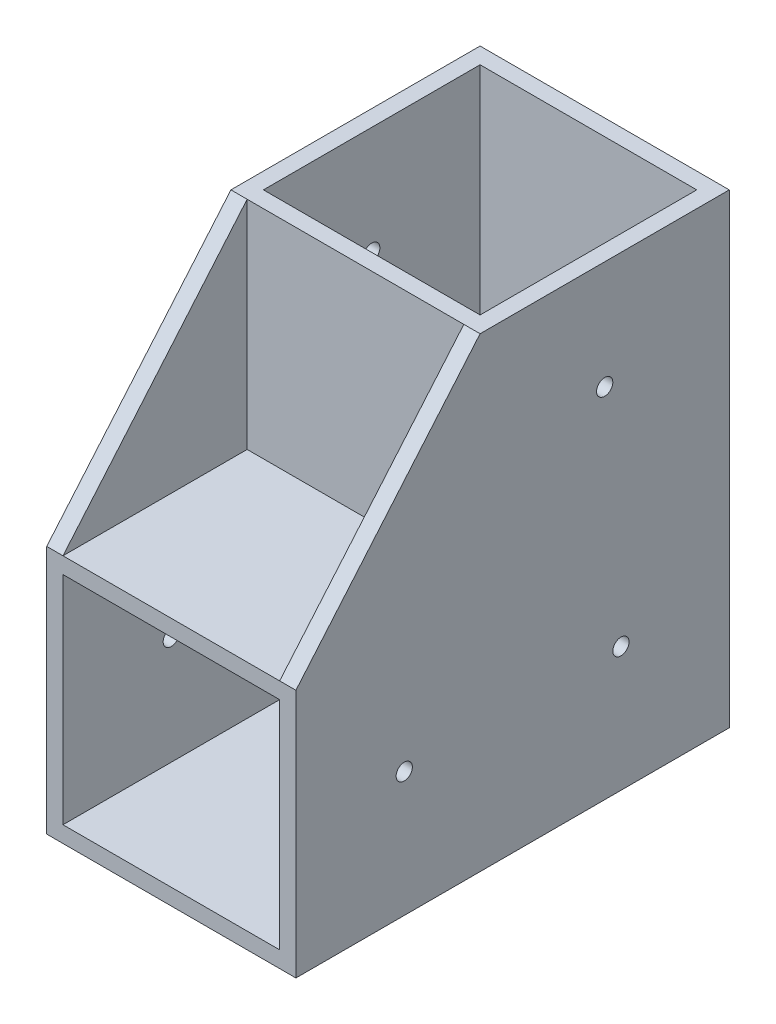
ISO-10303-21;
HEADER;
FILE_DESCRIPTION(('STEP AP214'),'2;1');
FILE_NAME('part.step','',(''),(''),'','','');
FILE_SCHEMA(('AUTOMOTIVE_DESIGN { 1 0 10303 214 1 1 1 1 }'));
ENDSEC;
DATA;
#1=APPLICATION_CONTEXT('core data for automotive mechanical design processes');
#2=APPLICATION_PROTOCOL_DEFINITION('international standard','automotive_design',2000,#1);
#3=PRODUCT_CONTEXT('',#1,'mechanical');
#4=PRODUCT('Part','Part','',(#3));
#5=PRODUCT_RELATED_PRODUCT_CATEGORY('part','',(#4));
#6=PRODUCT_DEFINITION_FORMATION('','',#4);
#7=PRODUCT_DEFINITION_CONTEXT('part definition',#1,'design');
#8=PRODUCT_DEFINITION('design','',#6,#7);
#9=PRODUCT_DEFINITION_SHAPE('','',#8);
#10=(LENGTH_UNIT() NAMED_UNIT(*) SI_UNIT(.MILLI.,.METRE.));
#11=(NAMED_UNIT(*) PLANE_ANGLE_UNIT() SI_UNIT($,.RADIAN.));
#12=(NAMED_UNIT(*) SI_UNIT($,.STERADIAN.) SOLID_ANGLE_UNIT());
#13=UNCERTAINTY_MEASURE_WITH_UNIT(LENGTH_MEASURE(1.E-05),#10,'distance_accuracy_value','');
#14=(GEOMETRIC_REPRESENTATION_CONTEXT(3) GLOBAL_UNCERTAINTY_ASSIGNED_CONTEXT((#13)) GLOBAL_UNIT_ASSIGNED_CONTEXT((#10,
#11,#12)) REPRESENTATION_CONTEXT('',''));
#15=CARTESIAN_POINT('',(0.,0.,0.));
#16=DIRECTION('',(0.,0.,1.));
#17=DIRECTION('',(1.,0.,0.));
#18=AXIS2_PLACEMENT_3D('',#15,#16,#17);
#19=CARTESIAN_POINT('',(0.,0.,80.));
#20=DIRECTION('',(0.,-1.,0.));
#21=DIRECTION('',(0.,0.,-1.));
#22=AXIS2_PLACEMENT_3D('',#19,#20,#21);
#23=PLANE('',#22);
#24=DIRECTION('',(0.,0.,1.));
#25=VECTOR('',#24,1.);
#26=CARTESIAN_POINT('',(3.,0.,80.));
#27=LINE('',#26,#25);
#28=CARTESIAN_POINT('',(3.,0.,46.));
#29=VERTEX_POINT('',#28);
#30=CARTESIAN_POINT('',(3.,0.,80.));
#31=VERTEX_POINT('',#30);
#32=EDGE_CURVE('E158',#29,#31,#27,.T.);
#33=ORIENTED_EDGE('',*,*,#32,.T.);
#34=DIRECTION('',(-1.,0.,0.));
#35=VECTOR('',#34,1.);
#36=CARTESIAN_POINT('',(0.,0.,80.));
#37=LINE('',#36,#35);
#38=CARTESIAN_POINT('',(43.,0.,80.));
#39=VERTEX_POINT('',#38);
#40=EDGE_CURVE('E252',#39,#31,#37,.T.);
#41=ORIENTED_EDGE('',*,*,#40,.F.);
#42=DIRECTION('',(0.,0.,-1.));
#43=VECTOR('',#42,1.);
#44=CARTESIAN_POINT('',(43.,0.,46.));
#45=LINE('',#44,#43);
#46=CARTESIAN_POINT('',(43.,0.,46.));
#47=VERTEX_POINT('',#46);
#48=EDGE_CURVE('E180',#39,#47,#45,.T.);
#49=ORIENTED_EDGE('',*,*,#48,.T.);
#50=DIRECTION('',(1.,0.,0.));
#51=VECTOR('',#50,1.);
#52=CARTESIAN_POINT('',(0.,0.,46.));
#53=LINE('',#52,#51);
#54=EDGE_CURVE('E172',#29,#47,#53,.T.);
#55=ORIENTED_EDGE('',*,*,#54,.F.);
#56=EDGE_LOOP('',(#33,#41,#49,#55));
#57=FACE_BOUND('',#56,.T.);
#58=ADVANCED_FACE('F42',(#57),#23,.F.);
#59=CARTESIAN_POINT('',(0.,40.,46.));
#60=DIRECTION('',(0.,0.,-1.));
#61=DIRECTION('',(-1.,0.,0.));
#62=AXIS2_PLACEMENT_3D('',#59,#60,#61);
#63=PLANE('',#62);
#64=DIRECTION('',(0.,-1.,0.));
#65=VECTOR('',#64,1.);
#66=CARTESIAN_POINT('',(3.,0.,46.));
#67=LINE('',#66,#65);
#68=CARTESIAN_POINT('',(3.,40.,46.));
#69=VERTEX_POINT('',#68);
#70=EDGE_CURVE('E161',#69,#29,#67,.T.);
#71=ORIENTED_EDGE('',*,*,#70,.T.);
#72=ORIENTED_EDGE('',*,*,#54,.T.);
#73=DIRECTION('',(0.,1.,0.));
#74=VECTOR('',#73,1.);
#75=CARTESIAN_POINT('',(43.,40.,46.));
#76=LINE('',#75,#74);
#77=CARTESIAN_POINT('',(43.,40.,46.));
#78=VERTEX_POINT('',#77);
#79=EDGE_CURVE('E307',#47,#78,#76,.T.);
#80=ORIENTED_EDGE('',*,*,#79,.T.);
#81=DIRECTION('',(1.,0.,0.));
#82=VECTOR('',#81,1.);
#83=CARTESIAN_POINT('',(0.,40.,46.));
#84=LINE('',#83,#82);
#85=EDGE_CURVE('E174',#69,#78,#84,.T.);
#86=ORIENTED_EDGE('',*,*,#85,.F.);
#87=EDGE_LOOP('',(#71,#72,#80,#86));
#88=FACE_BOUND('',#87,.T.);
#89=ADVANCED_FACE('F170',(#88),#63,.F.);
#90=CARTESIAN_POINT('',(0.,0.,80.));
#91=DIRECTION('',(0.,0.,1.));
#92=DIRECTION('',(1.,0.,0.));
#93=AXIS2_PLACEMENT_3D('',#90,#91,#92);
#94=PLANE('',#93);
#95=DIRECTION('',(0.,-1.,0.));
#96=VECTOR('',#95,1.);
#97=CARTESIAN_POINT('',(0.,0.,80.));
#98=LINE('',#97,#96);
#99=CARTESIAN_POINT('',(0.,0.,80.));
#100=VERTEX_POINT('',#99);
#101=CARTESIAN_POINT('',(0.,-46.,80.));
#102=VERTEX_POINT('',#101);
#103=EDGE_CURVE('E240',#100,#102,#98,.T.);
#104=ORIENTED_EDGE('',*,*,#103,.T.);
#105=DIRECTION('',(1.,0.,0.));
#106=VECTOR('',#105,1.);
#107=CARTESIAN_POINT('',(0.,-46.,80.));
#108=LINE('',#107,#106);
#109=CARTESIAN_POINT('',(46.,-46.,80.));
#110=VERTEX_POINT('',#109);
#111=EDGE_CURVE('E244',#102,#110,#108,.T.);
#112=ORIENTED_EDGE('',*,*,#111,.T.);
#113=DIRECTION('',(0.,1.,0.));
#114=VECTOR('',#113,1.);
#115=CARTESIAN_POINT('',(46.,0.,80.));
#116=LINE('',#115,#114);
#117=CARTESIAN_POINT('',(46.,0.,80.));
#118=VERTEX_POINT('',#117);
#119=EDGE_CURVE('E248',#110,#118,#116,.T.);
#120=ORIENTED_EDGE('',*,*,#119,.T.);
#121=EDGE_CURVE('E253',#118,#39,#37,.T.);
#122=ORIENTED_EDGE('',*,*,#121,.T.);
#123=ORIENTED_EDGE('',*,*,#40,.T.);
#124=DIRECTION('',(-1.,0.,0.));
#125=VECTOR('',#124,1.);
#126=CARTESIAN_POINT('',(3.,0.,80.));
#127=LINE('',#126,#125);
#128=EDGE_CURVE('E297',#31,#100,#127,.T.);
#129=ORIENTED_EDGE('',*,*,#128,.T.);
#130=EDGE_LOOP('',(#104,#112,#120,#122,#123,#129));
#131=FACE_BOUND('',#130,.T.);
#132=DIRECTION('',(1.,0.,0.));
#133=VECTOR('',#132,1.);
#134=CARTESIAN_POINT('',(3.00000000000001,-43.,80.));
#135=LINE('',#134,#133);
#136=CARTESIAN_POINT('',(3.00000000000001,-43.,80.));
#137=VERTEX_POINT('',#136);
#138=CARTESIAN_POINT('',(43.,-43.,80.));
#139=VERTEX_POINT('',#138);
#140=EDGE_CURVE('E199',#137,#139,#135,.T.);
#141=ORIENTED_EDGE('',*,*,#140,.F.);
#142=DIRECTION('',(0.,-1.,0.));
#143=VECTOR('',#142,1.);
#144=CARTESIAN_POINT('',(3.,-3.,80.));
#145=LINE('',#144,#143);
#146=CARTESIAN_POINT('',(3.,-3.,80.));
#147=VERTEX_POINT('',#146);
#148=EDGE_CURVE('E196',#147,#137,#145,.T.);
#149=ORIENTED_EDGE('',*,*,#148,.F.);
#150=DIRECTION('',(-1.,0.,0.));
#151=VECTOR('',#150,1.);
#152=CARTESIAN_POINT('',(3.,-3.,80.));
#153=LINE('',#152,#151);
#154=CARTESIAN_POINT('',(43.,-3.,80.));
#155=VERTEX_POINT('',#154);
#156=EDGE_CURVE('E207',#155,#147,#153,.T.);
#157=ORIENTED_EDGE('',*,*,#156,.F.);
#158=DIRECTION('',(0.,1.,0.));
#159=VECTOR('',#158,1.);
#160=CARTESIAN_POINT('',(43.,-3.,80.));
#161=LINE('',#160,#159);
#162=EDGE_CURVE('E203',#139,#155,#161,.T.);
#163=ORIENTED_EDGE('',*,*,#162,.F.);
#164=EDGE_LOOP('',(#141,#149,#157,#163));
#165=FACE_BOUND('',#164,.T.);
#166=ADVANCED_FACE('F377',(#131,#165),#94,.T.);
#167=CARTESIAN_POINT('',(0.,0.,0.));
#168=DIRECTION('',(0.,0.,1.));
#169=DIRECTION('',(1.,0.,0.));
#170=AXIS2_PLACEMENT_3D('',#167,#168,#169);
#171=PLANE('',#170);
#172=DIRECTION('',(0.,-1.,0.));
#173=VECTOR('',#172,1.);
#174=CARTESIAN_POINT('',(0.,0.,0.));
#175=LINE('',#174,#173);
#176=CARTESIAN_POINT('',(0.,40.,0.));
#177=VERTEX_POINT('',#176);
#178=CARTESIAN_POINT('',(0.,-46.,0.));
#179=VERTEX_POINT('',#178);
#180=EDGE_CURVE('E239',#177,#179,#175,.T.);
#181=ORIENTED_EDGE('',*,*,#180,.F.);
#182=DIRECTION('',(-1.,0.,0.));
#183=VECTOR('',#182,1.);
#184=CARTESIAN_POINT('',(0.,40.,0.));
#185=LINE('',#184,#183);
#186=CARTESIAN_POINT('',(46.,40.,0.));
#187=VERTEX_POINT('',#186);
#188=EDGE_CURVE('E194',#187,#177,#185,.T.);
#189=ORIENTED_EDGE('',*,*,#188,.F.);
#190=DIRECTION('',(0.,1.,0.));
#191=VECTOR('',#190,1.);
#192=CARTESIAN_POINT('',(46.,0.,0.));
#193=LINE('',#192,#191);
#194=CARTESIAN_POINT('',(46.,-46.,0.));
#195=VERTEX_POINT('',#194);
#196=EDGE_CURVE('E245',#195,#187,#193,.T.);
#197=ORIENTED_EDGE('',*,*,#196,.F.);
#198=DIRECTION('',(1.,0.,0.));
#199=VECTOR('',#198,1.);
#200=CARTESIAN_POINT('',(0.,-46.,0.));
#201=LINE('',#200,#199);
#202=EDGE_CURVE('E260',#179,#195,#201,.T.);
#203=ORIENTED_EDGE('',*,*,#202,.F.);
#204=EDGE_LOOP('',(#181,#189,#197,#203));
#205=FACE_BOUND('',#204,.T.);
#206=DIRECTION('',(0.,-1.,0.));
#207=VECTOR('',#206,1.);
#208=CARTESIAN_POINT('',(3.,-3.,0.));
#209=LINE('',#208,#207);
#210=CARTESIAN_POINT('',(3.,-3.,0.));
#211=VERTEX_POINT('',#210);
#212=CARTESIAN_POINT('',(3.00000000000001,-43.,0.));
#213=VERTEX_POINT('',#212);
#214=EDGE_CURVE('E211',#211,#213,#209,.T.);
#215=ORIENTED_EDGE('',*,*,#214,.T.);
#216=DIRECTION('',(1.,0.,0.));
#217=VECTOR('',#216,1.);
#218=CARTESIAN_POINT('',(3.00000000000001,-43.,0.));
#219=LINE('',#218,#217);
#220=CARTESIAN_POINT('',(43.,-43.,0.));
#221=VERTEX_POINT('',#220);
#222=EDGE_CURVE('E215',#213,#221,#219,.T.);
#223=ORIENTED_EDGE('',*,*,#222,.T.);
#224=DIRECTION('',(0.,1.,0.));
#225=VECTOR('',#224,1.);
#226=CARTESIAN_POINT('',(43.,-3.,0.));
#227=LINE('',#226,#225);
#228=CARTESIAN_POINT('',(43.,-3.,0.));
#229=VERTEX_POINT('',#228);
#230=EDGE_CURVE('E219',#221,#229,#227,.T.);
#231=ORIENTED_EDGE('',*,*,#230,.T.);
#232=DIRECTION('',(-1.,0.,0.));
#233=VECTOR('',#232,1.);
#234=CARTESIAN_POINT('',(3.,-3.,0.));
#235=LINE('',#234,#233);
#236=EDGE_CURVE('E200',#229,#211,#235,.T.);
#237=ORIENTED_EDGE('',*,*,#236,.T.);
#238=EDGE_LOOP('',(#215,#223,#231,#237));
#239=FACE_BOUND('',#238,.T.);
#240=ADVANCED_FACE('F388',(#205,#239),#171,.F.);
#241=CARTESIAN_POINT('',(0.,0.,80.));
#242=DIRECTION('',(1.,0.,0.));
#243=DIRECTION('',(0.,1.,0.));
#244=AXIS2_PLACEMENT_3D('',#241,#242,#243);
#245=PLANE('',#244);
#246=CARTESIAN_POINT('',(0.,20.,23.));
#247=DIRECTION('',(-1.,0.,0.));
#248=DIRECTION('',(0.,-1.,0.));
#249=AXIS2_PLACEMENT_3D('',#246,#247,#248);
#250=CIRCLE('',#249,1.5);
#251=CARTESIAN_POINT('',(0.,18.5,23.));
#252=VERTEX_POINT('',#251);
#253=EDGE_CURVE('E718',#252,#252,#250,.T.);
#254=ORIENTED_EDGE('',*,*,#253,.F.);
#255=EDGE_LOOP('',(#254));
#256=FACE_BOUND('',#255,.T.);
#257=CARTESIAN_POINT('',(0.,-23.,20.));
#258=DIRECTION('',(-1.,0.,0.));
#259=DIRECTION('',(0.,-1.,0.));
#260=AXIS2_PLACEMENT_3D('',#257,#258,#259);
#261=CIRCLE('',#260,1.5);
#262=CARTESIAN_POINT('',(0.,-24.5,20.));
#263=VERTEX_POINT('',#262);
#264=EDGE_CURVE('E715',#263,#263,#261,.T.);
#265=ORIENTED_EDGE('',*,*,#264,.F.);
#266=EDGE_LOOP('',(#265));
#267=FACE_BOUND('',#266,.T.);
#268=CARTESIAN_POINT('',(0.,-23.,60.));
#269=DIRECTION('',(-1.,0.,0.));
#270=DIRECTION('',(0.,-1.,0.));
#271=AXIS2_PLACEMENT_3D('',#268,#269,#270);
#272=CIRCLE('',#271,1.5);
#273=CARTESIAN_POINT('',(0.,-24.5,60.));
#274=VERTEX_POINT('',#273);
#275=EDGE_CURVE('E726',#274,#274,#272,.T.);
#276=ORIENTED_EDGE('',*,*,#275,.F.);
#277=EDGE_LOOP('',(#276));
#278=FACE_BOUND('',#277,.T.);
#279=ORIENTED_EDGE('',*,*,#180,.T.);
#280=DIRECTION('',(0.,0.,-1.));
#281=VECTOR('',#280,1.);
#282=CARTESIAN_POINT('',(0.,-46.,80.));
#283=LINE('',#282,#281);
#284=EDGE_CURVE('E11',#102,#179,#283,.T.);
#285=ORIENTED_EDGE('',*,*,#284,.F.);
#286=ORIENTED_EDGE('',*,*,#103,.F.);
#287=DIRECTION('',(0.,0.761939317759459,-0.64764842009554));
#288=VECTOR('',#287,1.);
#289=CARTESIAN_POINT('',(0.,40.,46.));
#290=LINE('',#289,#288);
#291=CARTESIAN_POINT('',(0.,40.,46.));
#292=VERTEX_POINT('',#291);
#293=EDGE_CURVE('E177',#100,#292,#290,.T.);
#294=ORIENTED_EDGE('',*,*,#293,.T.);
#295=DIRECTION('',(0.,0.,1.));
#296=VECTOR('',#295,1.);
#297=CARTESIAN_POINT('',(0.,40.,0.));
#298=LINE('',#297,#296);
#299=EDGE_CURVE('E182',#177,#292,#298,.T.);
#300=ORIENTED_EDGE('',*,*,#299,.F.);
#301=EDGE_LOOP('',(#279,#285,#286,#294,#300));
#302=FACE_BOUND('',#301,.T.);
#303=ADVANCED_FACE('F44',(#256,#267,#278,#302),#245,.F.);
#304=CARTESIAN_POINT('',(0.,-46.,80.));
#305=DIRECTION('',(0.,1.,0.));
#306=DIRECTION('',(0.,0.,1.));
#307=AXIS2_PLACEMENT_3D('',#304,#305,#306);
#308=PLANE('',#307);
#309=ORIENTED_EDGE('',*,*,#202,.T.);
#310=DIRECTION('',(0.,0.,-1.));
#311=VECTOR('',#310,1.);
#312=CARTESIAN_POINT('',(46.,-46.,80.));
#313=LINE('',#312,#311);
#314=EDGE_CURVE('E52',#110,#195,#313,.T.);
#315=ORIENTED_EDGE('',*,*,#314,.F.);
#316=ORIENTED_EDGE('',*,*,#111,.F.);
#317=ORIENTED_EDGE('',*,*,#284,.T.);
#318=EDGE_LOOP('',(#309,#315,#316,#317));
#319=FACE_BOUND('',#318,.T.);
#320=ADVANCED_FACE('F391',(#319),#308,.F.);
#321=CARTESIAN_POINT('',(46.,0.,80.));
#322=DIRECTION('',(-1.,0.,0.));
#323=DIRECTION('',(0.,-1.,0.));
#324=AXIS2_PLACEMENT_3D('',#321,#322,#323);
#325=PLANE('',#324);
#326=CARTESIAN_POINT('',(46.,20.,23.));
#327=DIRECTION('',(-1.,0.,0.));
#328=DIRECTION('',(0.,-1.,0.));
#329=AXIS2_PLACEMENT_3D('',#326,#327,#328);
#330=CIRCLE('',#329,1.5);
#331=CARTESIAN_POINT('',(46.,18.5,23.));
#332=VERTEX_POINT('',#331);
#333=EDGE_CURVE('E272',#332,#332,#330,.T.);
#334=ORIENTED_EDGE('',*,*,#333,.T.);
#335=EDGE_LOOP('',(#334));
#336=FACE_BOUND('',#335,.T.);
#337=CARTESIAN_POINT('',(46.,-23.,20.));
#338=DIRECTION('',(-1.,0.,0.));
#339=DIRECTION('',(0.,-1.,0.));
#340=AXIS2_PLACEMENT_3D('',#337,#338,#339);
#341=CIRCLE('',#340,1.5);
#342=CARTESIAN_POINT('',(46.,-24.5,20.));
#343=VERTEX_POINT('',#342);
#344=EDGE_CURVE('E719',#343,#343,#341,.T.);
#345=ORIENTED_EDGE('',*,*,#344,.T.);
#346=EDGE_LOOP('',(#345));
#347=FACE_BOUND('',#346,.T.);
#348=CARTESIAN_POINT('',(46.,-23.,60.));
#349=DIRECTION('',(-1.,0.,0.));
#350=DIRECTION('',(0.,-1.,0.));
#351=AXIS2_PLACEMENT_3D('',#348,#349,#350);
#352=CIRCLE('',#351,1.5);
#353=CARTESIAN_POINT('',(46.,-24.5,60.));
#354=VERTEX_POINT('',#353);
#355=EDGE_CURVE('E288',#354,#354,#352,.T.);
#356=ORIENTED_EDGE('',*,*,#355,.T.);
#357=EDGE_LOOP('',(#356));
#358=FACE_BOUND('',#357,.T.);
#359=ORIENTED_EDGE('',*,*,#196,.T.);
#360=DIRECTION('',(0.,0.,-1.));
#361=VECTOR('',#360,1.);
#362=CARTESIAN_POINT('',(46.,40.,0.));
#363=LINE('',#362,#361);
#364=CARTESIAN_POINT('',(46.,40.,46.));
#365=VERTEX_POINT('',#364);
#366=EDGE_CURVE('E359',#365,#187,#363,.T.);
#367=ORIENTED_EDGE('',*,*,#366,.F.);
#368=DIRECTION('',(0.,-0.761939317759459,0.64764842009554));
#369=VECTOR('',#368,1.);
#370=CARTESIAN_POINT('',(46.,0.,80.));
#371=LINE('',#370,#369);
#372=EDGE_CURVE('E304',#365,#118,#371,.T.);
#373=ORIENTED_EDGE('',*,*,#372,.T.);
#374=ORIENTED_EDGE('',*,*,#119,.F.);
#375=ORIENTED_EDGE('',*,*,#314,.T.);
#376=EDGE_LOOP('',(#359,#367,#373,#374,#375));
#377=FACE_BOUND('',#376,.T.);
#378=ADVANCED_FACE('F386',(#336,#347,#358,#377),#325,.F.);
#379=CARTESIAN_POINT('',(3.,-3.,80.));
#380=DIRECTION('',(1.,0.,0.));
#381=DIRECTION('',(0.,1.,0.));
#382=AXIS2_PLACEMENT_3D('',#379,#380,#381);
#383=PLANE('',#382);
#384=CARTESIAN_POINT('',(3.,-23.,20.));
#385=DIRECTION('',(1.,0.,0.));
#386=DIRECTION('',(0.,1.,0.));
#387=AXIS2_PLACEMENT_3D('',#384,#385,#386);
#388=CIRCLE('',#387,1.5);
#389=CARTESIAN_POINT('',(3.,-21.5,20.));
#390=VERTEX_POINT('',#389);
#391=EDGE_CURVE('E291',#390,#390,#388,.T.);
#392=ORIENTED_EDGE('',*,*,#391,.F.);
#393=EDGE_LOOP('',(#392));
#394=FACE_BOUND('',#393,.T.);
#395=CARTESIAN_POINT('',(3.,-23.,60.));
#396=DIRECTION('',(1.,0.,0.));
#397=DIRECTION('',(0.,1.,0.));
#398=AXIS2_PLACEMENT_3D('',#395,#396,#397);
#399=CIRCLE('',#398,1.5);
#400=CARTESIAN_POINT('',(3.,-21.5,60.));
#401=VERTEX_POINT('',#400);
#402=EDGE_CURVE('E276',#401,#401,#399,.T.);
#403=ORIENTED_EDGE('',*,*,#402,.F.);
#404=EDGE_LOOP('',(#403));
#405=FACE_BOUND('',#404,.T.);
#406=ORIENTED_EDGE('',*,*,#214,.F.);
#407=DIRECTION('',(0.,0.,-1.));
#408=VECTOR('',#407,1.);
#409=CARTESIAN_POINT('',(3.,-3.,80.));
#410=LINE('',#409,#408);
#411=EDGE_CURVE('E210',#147,#211,#410,.T.);
#412=ORIENTED_EDGE('',*,*,#411,.F.);
#413=ORIENTED_EDGE('',*,*,#148,.T.);
#414=DIRECTION('',(0.,0.,-1.));
#415=VECTOR('',#414,1.);
#416=CARTESIAN_POINT('',(3.00000000000001,-43.,80.));
#417=LINE('',#416,#415);
#418=EDGE_CURVE('E235',#137,#213,#417,.T.);
#419=ORIENTED_EDGE('',*,*,#418,.T.);
#420=EDGE_LOOP('',(#406,#412,#413,#419));
#421=FACE_BOUND('',#420,.T.);
#422=ADVANCED_FACE('F398',(#394,#405,#421),#383,.T.);
#423=CARTESIAN_POINT('',(3.00000000000001,-43.,80.));
#424=DIRECTION('',(0.,1.,0.));
#425=DIRECTION('',(0.,0.,1.));
#426=AXIS2_PLACEMENT_3D('',#423,#424,#425);
#427=PLANE('',#426);
#428=ORIENTED_EDGE('',*,*,#222,.F.);
#429=ORIENTED_EDGE('',*,*,#418,.F.);
#430=ORIENTED_EDGE('',*,*,#140,.T.);
#431=DIRECTION('',(0.,0.,-1.));
#432=VECTOR('',#431,1.);
#433=CARTESIAN_POINT('',(43.,-43.,80.));
#434=LINE('',#433,#432);
#435=EDGE_CURVE('E232',#139,#221,#434,.T.);
#436=ORIENTED_EDGE('',*,*,#435,.T.);
#437=EDGE_LOOP('',(#428,#429,#430,#436));
#438=FACE_BOUND('',#437,.T.);
#439=ADVANCED_FACE('F456',(#438),#427,.T.);
#440=CARTESIAN_POINT('',(43.,-3.,80.));
#441=DIRECTION('',(-1.,0.,0.));
#442=DIRECTION('',(0.,-1.,0.));
#443=AXIS2_PLACEMENT_3D('',#440,#441,#442);
#444=PLANE('',#443);
#445=CARTESIAN_POINT('',(43.,-23.,20.));
#446=DIRECTION('',(-1.,0.,0.));
#447=DIRECTION('',(0.,-1.,0.));
#448=AXIS2_PLACEMENT_3D('',#445,#446,#447);
#449=CIRCLE('',#448,1.5);
#450=CARTESIAN_POINT('',(43.,-24.5,20.));
#451=VERTEX_POINT('',#450);
#452=EDGE_CURVE('E46',#451,#451,#449,.T.);
#453=ORIENTED_EDGE('',*,*,#452,.F.);
#454=EDGE_LOOP('',(#453));
#455=FACE_BOUND('',#454,.T.);
#456=CARTESIAN_POINT('',(43.,-23.,60.));
#457=DIRECTION('',(-1.,0.,0.));
#458=DIRECTION('',(0.,-1.,0.));
#459=AXIS2_PLACEMENT_3D('',#456,#457,#458);
#460=CIRCLE('',#459,1.5);
#461=CARTESIAN_POINT('',(43.,-24.5,60.));
#462=VERTEX_POINT('',#461);
#463=EDGE_CURVE('E273',#462,#462,#460,.T.);
#464=ORIENTED_EDGE('',*,*,#463,.F.);
#465=EDGE_LOOP('',(#464));
#466=FACE_BOUND('',#465,.T.);
#467=ORIENTED_EDGE('',*,*,#230,.F.);
#468=ORIENTED_EDGE('',*,*,#435,.F.);
#469=ORIENTED_EDGE('',*,*,#162,.T.);
#470=DIRECTION('',(0.,0.,-1.));
#471=VECTOR('',#470,1.);
#472=CARTESIAN_POINT('',(43.,-3.,80.));
#473=LINE('',#472,#471);
#474=EDGE_CURVE('E229',#155,#229,#473,.T.);
#475=ORIENTED_EDGE('',*,*,#474,.T.);
#476=EDGE_LOOP('',(#467,#468,#469,#475));
#477=FACE_BOUND('',#476,.T.);
#478=ADVANCED_FACE('F452',(#455,#466,#477),#444,.T.);
#479=CARTESIAN_POINT('',(3.,-3.,80.));
#480=DIRECTION('',(0.,-1.,0.));
#481=DIRECTION('',(0.,0.,-1.));
#482=AXIS2_PLACEMENT_3D('',#479,#480,#481);
#483=PLANE('',#482);
#484=ORIENTED_EDGE('',*,*,#236,.F.);
#485=ORIENTED_EDGE('',*,*,#474,.F.);
#486=ORIENTED_EDGE('',*,*,#156,.T.);
#487=ORIENTED_EDGE('',*,*,#411,.T.);
#488=EDGE_LOOP('',(#484,#485,#486,#487));
#489=FACE_BOUND('',#488,.T.);
#490=ADVANCED_FACE('F448',(#489),#483,.T.);
#491=CARTESIAN_POINT('',(0.,40.,0.));
#492=DIRECTION('',(0.,1.,0.));
#493=DIRECTION('',(0.,0.,1.));
#494=AXIS2_PLACEMENT_3D('',#491,#492,#493);
#495=PLANE('',#494);
#496=ORIENTED_EDGE('',*,*,#299,.T.);
#497=EDGE_CURVE('E357',#292,#69,#84,.T.);
#498=ORIENTED_EDGE('',*,*,#497,.T.);
#499=ORIENTED_EDGE('',*,*,#85,.T.);
#500=DIRECTION('',(1.,0.,0.));
#501=VECTOR('',#500,1.);
#502=CARTESIAN_POINT('',(43.,40.,46.));
#503=LINE('',#502,#501);
#504=EDGE_CURVE('E314',#78,#365,#503,.T.);
#505=ORIENTED_EDGE('',*,*,#504,.T.);
#506=ORIENTED_EDGE('',*,*,#366,.T.);
#507=ORIENTED_EDGE('',*,*,#188,.T.);
#508=EDGE_LOOP('',(#496,#498,#499,#505,#506,#507));
#509=FACE_BOUND('',#508,.T.);
#510=DIRECTION('',(1.,0.,0.));
#511=VECTOR('',#510,1.);
#512=CARTESIAN_POINT('',(3.,40.,43.));
#513=LINE('',#512,#511);
#514=CARTESIAN_POINT('',(3.,40.,43.));
#515=VERTEX_POINT('',#514);
#516=CARTESIAN_POINT('',(43.,40.,43.));
#517=VERTEX_POINT('',#516);
#518=EDGE_CURVE('E325',#515,#517,#513,.T.);
#519=ORIENTED_EDGE('',*,*,#518,.F.);
#520=DIRECTION('',(0.,0.,1.));
#521=VECTOR('',#520,1.);
#522=CARTESIAN_POINT('',(3.,40.,3.));
#523=LINE('',#522,#521);
#524=CARTESIAN_POINT('',(3.,40.,3.));
#525=VERTEX_POINT('',#524);
#526=EDGE_CURVE('E322',#525,#515,#523,.T.);
#527=ORIENTED_EDGE('',*,*,#526,.F.);
#528=DIRECTION('',(-1.,0.,0.));
#529=VECTOR('',#528,1.);
#530=CARTESIAN_POINT('',(3.,40.,3.));
#531=LINE('',#530,#529);
#532=CARTESIAN_POINT('',(43.,40.,3.));
#533=VERTEX_POINT('',#532);
#534=EDGE_CURVE('E333',#533,#525,#531,.T.);
#535=ORIENTED_EDGE('',*,*,#534,.F.);
#536=DIRECTION('',(0.,0.,-1.));
#537=VECTOR('',#536,1.);
#538=CARTESIAN_POINT('',(43.,40.,3.));
#539=LINE('',#538,#537);
#540=EDGE_CURVE('E329',#517,#533,#539,.T.);
#541=ORIENTED_EDGE('',*,*,#540,.F.);
#542=EDGE_LOOP('',(#519,#527,#535,#541));
#543=FACE_BOUND('',#542,.T.);
#544=ADVANCED_FACE('F368',(#509,#543),#495,.T.);
#545=CARTESIAN_POINT('',(3.,40.,3.));
#546=DIRECTION('',(1.,0.,0.));
#547=DIRECTION('',(0.,0.,-1.));
#548=AXIS2_PLACEMENT_3D('',#545,#546,#547);
#549=PLANE('',#548);
#550=CARTESIAN_POINT('',(3.,20.,23.));
#551=DIRECTION('',(1.,0.,0.));
#552=DIRECTION('',(0.,0.,-1.));
#553=AXIS2_PLACEMENT_3D('',#550,#551,#552);
#554=CIRCLE('',#553,1.5);
#555=CARTESIAN_POINT('',(3.,20.,21.5));
#556=VERTEX_POINT('',#555);
#557=EDGE_CURVE('E271',#556,#556,#554,.T.);
#558=ORIENTED_EDGE('',*,*,#557,.F.);
#559=EDGE_LOOP('',(#558));
#560=FACE_BOUND('',#559,.T.);
#561=DIRECTION('',(0.,0.,1.));
#562=VECTOR('',#561,1.);
#563=CARTESIAN_POINT('',(3.,0.,3.));
#564=LINE('',#563,#562);
#565=CARTESIAN_POINT('',(3.,0.,3.));
#566=VERTEX_POINT('',#565);
#567=CARTESIAN_POINT('',(3.,0.,43.));
#568=VERTEX_POINT('',#567);
#569=EDGE_CURVE('E321',#566,#568,#564,.T.);
#570=ORIENTED_EDGE('',*,*,#569,.F.);
#571=DIRECTION('',(0.,-1.,0.));
#572=VECTOR('',#571,1.);
#573=CARTESIAN_POINT('',(3.,40.,3.));
#574=LINE('',#573,#572);
#575=EDGE_CURVE('E68',#525,#566,#574,.T.);
#576=ORIENTED_EDGE('',*,*,#575,.F.);
#577=ORIENTED_EDGE('',*,*,#526,.T.);
#578=DIRECTION('',(0.,-1.,0.));
#579=VECTOR('',#578,1.);
#580=CARTESIAN_POINT('',(3.,40.,43.));
#581=LINE('',#580,#579);
#582=EDGE_CURVE('E183',#515,#568,#581,.T.);
#583=ORIENTED_EDGE('',*,*,#582,.T.);
#584=EDGE_LOOP('',(#570,#576,#577,#583));
#585=FACE_BOUND('',#584,.T.);
#586=ADVANCED_FACE('F431',(#560,#585),#549,.T.);
#587=CARTESIAN_POINT('',(3.,40.,43.));
#588=DIRECTION('',(0.,0.,-1.));
#589=DIRECTION('',(-1.,0.,0.));
#590=AXIS2_PLACEMENT_3D('',#587,#588,#589);
#591=PLANE('',#590);
#592=DIRECTION('',(1.,0.,0.));
#593=VECTOR('',#592,1.);
#594=CARTESIAN_POINT('',(3.,0.,43.));
#595=LINE('',#594,#593);
#596=CARTESIAN_POINT('',(43.,0.,43.));
#597=VERTEX_POINT('',#596);
#598=EDGE_CURVE('E339',#568,#597,#595,.T.);
#599=ORIENTED_EDGE('',*,*,#598,.F.);
#600=ORIENTED_EDGE('',*,*,#582,.F.);
#601=ORIENTED_EDGE('',*,*,#518,.T.);
#602=DIRECTION('',(0.,-1.,0.));
#603=VECTOR('',#602,1.);
#604=CARTESIAN_POINT('',(43.,40.,43.));
#605=LINE('',#604,#603);
#606=EDGE_CURVE('E190',#517,#597,#605,.T.);
#607=ORIENTED_EDGE('',*,*,#606,.T.);
#608=EDGE_LOOP('',(#599,#600,#601,#607));
#609=FACE_BOUND('',#608,.T.);
#610=ADVANCED_FACE('F433',(#609),#591,.T.);
#611=CARTESIAN_POINT('',(43.,40.,3.));
#612=DIRECTION('',(-1.,0.,0.));
#613=DIRECTION('',(0.,0.,1.));
#614=AXIS2_PLACEMENT_3D('',#611,#612,#613);
#615=PLANE('',#614);
#616=CARTESIAN_POINT('',(43.,20.,23.));
#617=DIRECTION('',(-1.,0.,0.));
#618=DIRECTION('',(0.,0.,1.));
#619=AXIS2_PLACEMENT_3D('',#616,#617,#618);
#620=CIRCLE('',#619,1.5);
#621=CARTESIAN_POINT('',(43.,20.,24.5));
#622=VERTEX_POINT('',#621);
#623=EDGE_CURVE('E268',#622,#622,#620,.T.);
#624=ORIENTED_EDGE('',*,*,#623,.F.);
#625=EDGE_LOOP('',(#624));
#626=FACE_BOUND('',#625,.T.);
#627=DIRECTION('',(0.,0.,-1.));
#628=VECTOR('',#627,1.);
#629=CARTESIAN_POINT('',(43.,0.,3.));
#630=LINE('',#629,#628);
#631=CARTESIAN_POINT('',(43.,0.,3.));
#632=VERTEX_POINT('',#631);
#633=EDGE_CURVE('E343',#597,#632,#630,.T.);
#634=ORIENTED_EDGE('',*,*,#633,.F.);
#635=ORIENTED_EDGE('',*,*,#606,.F.);
#636=ORIENTED_EDGE('',*,*,#540,.T.);
#637=DIRECTION('',(0.,-1.,0.));
#638=VECTOR('',#637,1.);
#639=CARTESIAN_POINT('',(43.,40.,3.));
#640=LINE('',#639,#638);
#641=EDGE_CURVE('E352',#533,#632,#640,.T.);
#642=ORIENTED_EDGE('',*,*,#641,.T.);
#643=EDGE_LOOP('',(#634,#635,#636,#642));
#644=FACE_BOUND('',#643,.T.);
#645=ADVANCED_FACE('F420',(#626,#644),#615,.T.);
#646=CARTESIAN_POINT('',(3.,40.,3.));
#647=DIRECTION('',(0.,0.,1.));
#648=DIRECTION('',(1.,0.,0.));
#649=AXIS2_PLACEMENT_3D('',#646,#647,#648);
#650=PLANE('',#649);
#651=DIRECTION('',(-1.,0.,0.));
#652=VECTOR('',#651,1.);
#653=CARTESIAN_POINT('',(3.,0.,3.));
#654=LINE('',#653,#652);
#655=EDGE_CURVE('E326',#632,#566,#654,.T.);
#656=ORIENTED_EDGE('',*,*,#655,.F.);
#657=ORIENTED_EDGE('',*,*,#641,.F.);
#658=ORIENTED_EDGE('',*,*,#534,.T.);
#659=ORIENTED_EDGE('',*,*,#575,.T.);
#660=EDGE_LOOP('',(#656,#657,#658,#659));
#661=FACE_BOUND('',#660,.T.);
#662=ADVANCED_FACE('F412',(#661),#650,.T.);
#663=ORIENTED_EDGE('',*,*,#655,.T.);
#664=ORIENTED_EDGE('',*,*,#569,.T.);
#665=ORIENTED_EDGE('',*,*,#598,.T.);
#666=ORIENTED_EDGE('',*,*,#633,.T.);
#667=EDGE_LOOP('',(#663,#664,#665,#666));
#668=FACE_BOUND('',#667,.T.);
#669=ADVANCED_FACE('F405',(#668),#23,.F.);
#670=CARTESIAN_POINT('',(43.,0.,80.));
#671=DIRECTION('',(0.,0.64764842009554,0.761939317759459));
#672=DIRECTION('',(0.,-0.761939317759459,0.64764842009554));
#673=AXIS2_PLACEMENT_3D('',#670,#671,#672);
#674=PLANE('',#673);
#675=ORIENTED_EDGE('',*,*,#372,.F.);
#676=ORIENTED_EDGE('',*,*,#504,.F.);
#677=DIRECTION('',(0.,-0.761939317759459,0.64764842009554));
#678=VECTOR('',#677,1.);
#679=CARTESIAN_POINT('',(43.,0.,80.));
#680=LINE('',#679,#678);
#681=EDGE_CURVE('E310',#78,#39,#680,.T.);
#682=ORIENTED_EDGE('',*,*,#681,.T.);
#683=ORIENTED_EDGE('',*,*,#121,.F.);
#684=EDGE_LOOP('',(#675,#676,#682,#683));
#685=FACE_BOUND('',#684,.T.);
#686=ADVANCED_FACE('F382',(#685),#674,.T.);
#687=CARTESIAN_POINT('',(43.,0.,0.));
#688=DIRECTION('',(1.,0.,0.));
#689=DIRECTION('',(0.,1.,0.));
#690=AXIS2_PLACEMENT_3D('',#687,#688,#689);
#691=PLANE('',#690);
#692=ORIENTED_EDGE('',*,*,#48,.F.);
#693=ORIENTED_EDGE('',*,*,#681,.F.);
#694=ORIENTED_EDGE('',*,*,#79,.F.);
#695=EDGE_LOOP('',(#692,#693,#694));
#696=FACE_BOUND('',#695,.T.);
#697=ADVANCED_FACE('F418',(#696),#691,.F.);
#698=CARTESIAN_POINT('',(2.99999999999999,40.,46.));
#699=DIRECTION('',(0.,0.64764842009554,0.761939317759459));
#700=DIRECTION('',(0.,-0.761939317759459,0.64764842009554));
#701=AXIS2_PLACEMENT_3D('',#698,#699,#700);
#702=PLANE('',#701);
#703=ORIENTED_EDGE('',*,*,#293,.F.);
#704=ORIENTED_EDGE('',*,*,#128,.F.);
#705=DIRECTION('',(0.,0.761939317759459,-0.64764842009554));
#706=VECTOR('',#705,1.);
#707=CARTESIAN_POINT('',(2.99999999999999,40.,46.));
#708=LINE('',#707,#706);
#709=EDGE_CURVE('E60',#31,#69,#708,.T.);
#710=ORIENTED_EDGE('',*,*,#709,.T.);
#711=ORIENTED_EDGE('',*,*,#497,.F.);
#712=EDGE_LOOP('',(#703,#704,#710,#711));
#713=FACE_BOUND('',#712,.T.);
#714=ADVANCED_FACE('F375',(#713),#702,.T.);
#715=CARTESIAN_POINT('',(3.,0.,0.));
#716=DIRECTION('',(-1.,0.,0.));
#717=DIRECTION('',(0.,-1.,0.));
#718=AXIS2_PLACEMENT_3D('',#715,#716,#717);
#719=PLANE('',#718);
#720=ORIENTED_EDGE('',*,*,#70,.F.);
#721=ORIENTED_EDGE('',*,*,#709,.F.);
#722=ORIENTED_EDGE('',*,*,#32,.F.);
#723=EDGE_LOOP('',(#720,#721,#722));
#724=FACE_BOUND('',#723,.T.);
#725=ADVANCED_FACE('F160',(#724),#719,.F.);
#726=CARTESIAN_POINT('',(46.,20.,23.));
#727=DIRECTION('',(-1.,0.,0.));
#728=DIRECTION('',(0.,-1.,0.));
#729=AXIS2_PLACEMENT_3D('',#726,#727,#728);
#730=CYLINDRICAL_SURFACE('',#729,1.5);
#731=ORIENTED_EDGE('',*,*,#623,.T.);
#732=EDGE_LOOP('',(#731));
#733=FACE_BOUND('',#732,.T.);
#734=ORIENTED_EDGE('',*,*,#333,.F.);
#735=EDGE_LOOP('',(#734));
#736=FACE_BOUND('',#735,.T.);
#737=ADVANCED_FACE('F504',(#733,#736),#730,.F.);
#738=ORIENTED_EDGE('',*,*,#557,.T.);
#739=EDGE_LOOP('',(#738));
#740=FACE_BOUND('',#739,.T.);
#741=ORIENTED_EDGE('',*,*,#253,.T.);
#742=EDGE_LOOP('',(#741));
#743=FACE_BOUND('',#742,.T.);
#744=ADVANCED_FACE('F509',(#740,#743),#730,.F.);
#745=CARTESIAN_POINT('',(46.,-23.,60.));
#746=DIRECTION('',(-1.,0.,0.));
#747=DIRECTION('',(0.,-1.,0.));
#748=AXIS2_PLACEMENT_3D('',#745,#746,#747);
#749=CYLINDRICAL_SURFACE('',#748,1.5);
#750=ORIENTED_EDGE('',*,*,#463,.T.);
#751=EDGE_LOOP('',(#750));
#752=FACE_BOUND('',#751,.T.);
#753=ORIENTED_EDGE('',*,*,#355,.F.);
#754=EDGE_LOOP('',(#753));
#755=FACE_BOUND('',#754,.T.);
#756=ADVANCED_FACE('F520',(#752,#755),#749,.F.);
#757=CARTESIAN_POINT('',(46.,-23.,20.));
#758=DIRECTION('',(-1.,0.,0.));
#759=DIRECTION('',(0.,-1.,0.));
#760=AXIS2_PLACEMENT_3D('',#757,#758,#759);
#761=CYLINDRICAL_SURFACE('',#760,1.5);
#762=ORIENTED_EDGE('',*,*,#452,.T.);
#763=EDGE_LOOP('',(#762));
#764=FACE_BOUND('',#763,.T.);
#765=ORIENTED_EDGE('',*,*,#344,.F.);
#766=EDGE_LOOP('',(#765));
#767=FACE_BOUND('',#766,.T.);
#768=ADVANCED_FACE('F529',(#764,#767),#761,.F.);
#769=ORIENTED_EDGE('',*,*,#402,.T.);
#770=EDGE_LOOP('',(#769));
#771=FACE_BOUND('',#770,.T.);
#772=ORIENTED_EDGE('',*,*,#275,.T.);
#773=EDGE_LOOP('',(#772));
#774=FACE_BOUND('',#773,.T.);
#775=ADVANCED_FACE('F531',(#771,#774),#749,.F.);
#776=ORIENTED_EDGE('',*,*,#391,.T.);
#777=EDGE_LOOP('',(#776));
#778=FACE_BOUND('',#777,.T.);
#779=ORIENTED_EDGE('',*,*,#264,.T.);
#780=EDGE_LOOP('',(#779));
#781=FACE_BOUND('',#780,.T.);
#782=ADVANCED_FACE('F542',(#778,#781),#761,.F.);
#783=CLOSED_SHELL('',(#58,#89,#166,#240,#303,#320,#378,#422,#439,#478,#490,#544,#586,#610,#645,
#662,#669,#686,#697,#714,#725,#737,#744,#756,#768,#775,#782));
#784=MANIFOLD_SOLID_BREP('B2',#783);
#785=ADVANCED_BREP_SHAPE_REPRESENTATION('',(#18,#784),#14);
#786=SHAPE_DEFINITION_REPRESENTATION(#9,#785);
ENDSEC;
END-ISO-10303-21;
